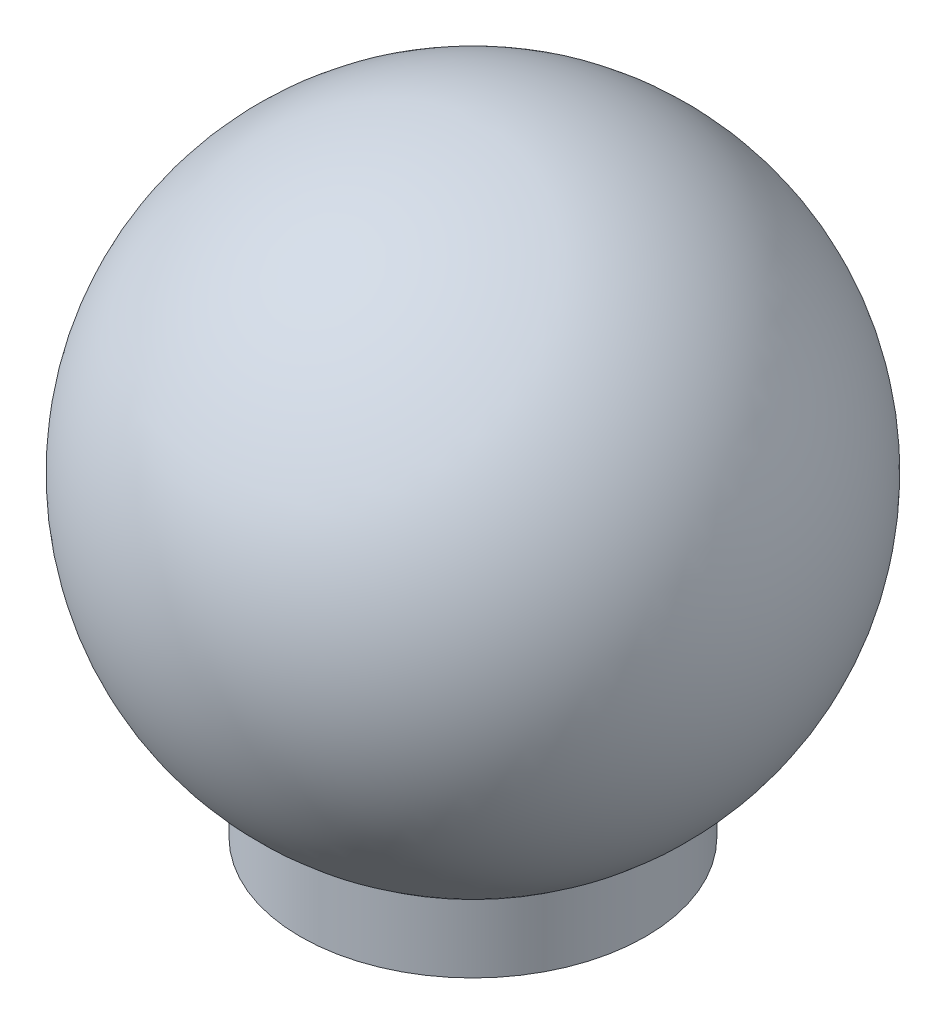
ISO-10303-21;
HEADER;
FILE_DESCRIPTION(('STEP AP214'),'2;1');
FILE_NAME('part.step','',(''),(''),'','','');
FILE_SCHEMA(('AUTOMOTIVE_DESIGN { 1 0 10303 214 1 1 1 1 }'));
ENDSEC;
DATA;
#1=APPLICATION_CONTEXT('core data for automotive mechanical design processes');
#2=APPLICATION_PROTOCOL_DEFINITION('international standard','automotive_design',2000,#1);
#3=PRODUCT_CONTEXT('',#1,'mechanical');
#4=PRODUCT('Part','Part','',(#3));
#5=PRODUCT_RELATED_PRODUCT_CATEGORY('part','',(#4));
#6=PRODUCT_DEFINITION_FORMATION('','',#4);
#7=PRODUCT_DEFINITION_CONTEXT('part definition',#1,'design');
#8=PRODUCT_DEFINITION('design','',#6,#7);
#9=PRODUCT_DEFINITION_SHAPE('','',#8);
#10=(LENGTH_UNIT() NAMED_UNIT(*) SI_UNIT(.MILLI.,.METRE.));
#11=(NAMED_UNIT(*) PLANE_ANGLE_UNIT() SI_UNIT($,.RADIAN.));
#12=(NAMED_UNIT(*) SI_UNIT($,.STERADIAN.) SOLID_ANGLE_UNIT());
#13=UNCERTAINTY_MEASURE_WITH_UNIT(LENGTH_MEASURE(1.E-05),#10,'distance_accuracy_value','');
#14=(GEOMETRIC_REPRESENTATION_CONTEXT(3) GLOBAL_UNCERTAINTY_ASSIGNED_CONTEXT((#13)) GLOBAL_UNIT_ASSIGNED_CONTEXT((#10,
#11,#12)) REPRESENTATION_CONTEXT('',''));
#15=CARTESIAN_POINT('',(0.,0.,0.));
#16=DIRECTION('',(0.,0.,1.));
#17=DIRECTION('',(1.,0.,0.));
#18=AXIS2_PLACEMENT_3D('',#15,#16,#17);
#19=CARTESIAN_POINT('',(0.,10.,0.));
#20=DIRECTION('',(0.,-1.,0.));
#21=DIRECTION('',(0.,0.,-1.));
#22=AXIS2_PLACEMENT_3D('',#19,#20,#21);
#23=CYLINDRICAL_SURFACE('',#22,25.4);
#24=CARTESIAN_POINT('',(0.,10.,0.));
#25=DIRECTION('',(0.,1.,0.));
#26=DIRECTION('',(0.,0.,1.));
#27=AXIS2_PLACEMENT_3D('',#24,#25,#26);
#28=CIRCLE('',#27,25.4);
#29=CARTESIAN_POINT('',(0.,10.,25.4));
#30=VERTEX_POINT('',#29);
#31=EDGE_CURVE('E10',#30,#30,#28,.T.);
#32=ORIENTED_EDGE('',*,*,#31,.F.);
#33=EDGE_LOOP('',(#32));
#34=FACE_BOUND('',#33,.T.);
#35=CARTESIAN_POINT('',(0.,0.,0.));
#36=DIRECTION('',(0.,1.,0.));
#37=DIRECTION('',(0.,0.,1.));
#38=AXIS2_PLACEMENT_3D('',#35,#36,#37);
#39=CIRCLE('',#38,25.4);
#40=CARTESIAN_POINT('',(0.,0.,25.4));
#41=VERTEX_POINT('',#40);
#42=EDGE_CURVE('E38',#41,#41,#39,.T.);
#43=ORIENTED_EDGE('',*,*,#42,.T.);
#44=EDGE_LOOP('',(#43));
#45=FACE_BOUND('',#44,.T.);
#46=ADVANCED_FACE('F35',(#34,#45),#23,.T.);
#47=CARTESIAN_POINT('',(0.,0.,0.));
#48=DIRECTION('',(0.,1.,0.));
#49=DIRECTION('',(0.,0.,1.));
#50=AXIS2_PLACEMENT_3D('',#47,#48,#49);
#51=PLANE('',#50);
#52=ORIENTED_EDGE('',*,*,#42,.F.);
#53=EDGE_LOOP('',(#52));
#54=FACE_BOUND('',#53,.T.);
#55=ADVANCED_FACE('F48',(#54),#51,.F.);
#56=CARTESIAN_POINT('',(0.,46.4779728055165,0.));
#57=DIRECTION('',(0.,1.,0.));
#58=DIRECTION('',(1.,0.,0.));
#59=AXIS2_PLACEMENT_3D('',#56,#57,#58);
#60=SPHERICAL_SURFACE('',#59,44.45);
#61=ORIENTED_EDGE('',*,*,#31,.T.);
#62=EDGE_LOOP('',(#61));
#63=FACE_BOUND('',#62,.T.);
#64=ADVANCED_FACE('F50',(#63),#60,.T.);
#65=CLOSED_SHELL('',(#46,#55,#64));
#66=MANIFOLD_SOLID_BREP('B2',#65);
#67=ADVANCED_BREP_SHAPE_REPRESENTATION('',(#18,#66),#14);
#68=SHAPE_DEFINITION_REPRESENTATION(#9,#67);
ENDSEC;
END-ISO-10303-21;
